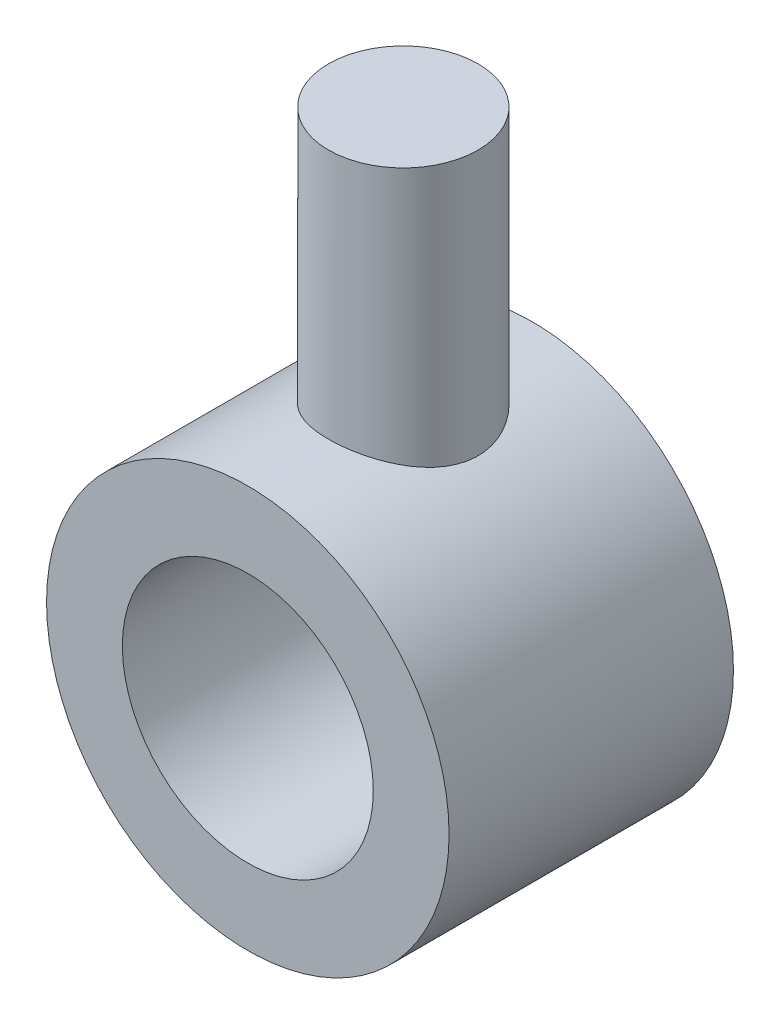
ISO-10303-21;
HEADER;
FILE_DESCRIPTION(('STEP AP214'),'2;1');
FILE_NAME('part.step','',(''),(''),'','','');
FILE_SCHEMA(('AUTOMOTIVE_DESIGN { 1 0 10303 214 1 1 1 1 }'));
ENDSEC;
DATA;
#1=APPLICATION_CONTEXT('core data for automotive mechanical design processes');
#2=APPLICATION_PROTOCOL_DEFINITION('international standard','automotive_design',2000,#1);
#3=PRODUCT_CONTEXT('',#1,'mechanical');
#4=PRODUCT('Part','Part','',(#3));
#5=PRODUCT_RELATED_PRODUCT_CATEGORY('part','',(#4));
#6=PRODUCT_DEFINITION_FORMATION('','',#4);
#7=PRODUCT_DEFINITION_CONTEXT('part definition',#1,'design');
#8=PRODUCT_DEFINITION('design','',#6,#7);
#9=PRODUCT_DEFINITION_SHAPE('','',#8);
#10=(LENGTH_UNIT() NAMED_UNIT(*) SI_UNIT(.MILLI.,.METRE.));
#11=(NAMED_UNIT(*) PLANE_ANGLE_UNIT() SI_UNIT($,.RADIAN.));
#12=(NAMED_UNIT(*) SI_UNIT($,.STERADIAN.) SOLID_ANGLE_UNIT());
#13=UNCERTAINTY_MEASURE_WITH_UNIT(LENGTH_MEASURE(1.E-05),#10,'distance_accuracy_value','');
#14=(GEOMETRIC_REPRESENTATION_CONTEXT(3) GLOBAL_UNCERTAINTY_ASSIGNED_CONTEXT((#13)) GLOBAL_UNIT_ASSIGNED_CONTEXT((#10,
#11,#12)) REPRESENTATION_CONTEXT('',''));
#15=CARTESIAN_POINT('',(0.,0.,0.));
#16=DIRECTION('',(0.,0.,1.));
#17=DIRECTION('',(1.,0.,0.));
#18=AXIS2_PLACEMENT_3D('',#15,#16,#17);
#19=CARTESIAN_POINT('',(0.,0.,17.));
#20=DIRECTION('',(0.,0.,-1.));
#21=DIRECTION('',(-1.,0.,0.));
#22=AXIS2_PLACEMENT_3D('',#19,#20,#21);
#23=CYLINDRICAL_SURFACE('',#22,12.0311317700619);
#24=CARTESIAN_POINT('',(0.,0.,17.));
#25=DIRECTION('',(0.,0.,1.));
#26=DIRECTION('',(1.,0.,0.));
#27=AXIS2_PLACEMENT_3D('',#24,#25,#26);
#28=CIRCLE('',#27,12.0311317700619);
#29=CARTESIAN_POINT('',(12.0311317700619,0.,17.));
#30=VERTEX_POINT('',#29);
#31=EDGE_CURVE('E42',#30,#30,#28,.T.);
#32=ORIENTED_EDGE('',*,*,#31,.F.);
#33=EDGE_LOOP('',(#32));
#34=FACE_BOUND('',#33,.T.);
#35=CARTESIAN_POINT('',(0.,0.,0.));
#36=DIRECTION('',(0.,0.,1.));
#37=DIRECTION('',(1.,0.,0.));
#38=AXIS2_PLACEMENT_3D('',#35,#36,#37);
#39=CIRCLE('',#38,12.0311317700619);
#40=CARTESIAN_POINT('',(12.0311317700619,0.,0.));
#41=VERTEX_POINT('',#40);
#42=EDGE_CURVE('E46',#41,#41,#39,.T.);
#43=ORIENTED_EDGE('',*,*,#42,.T.);
#44=EDGE_LOOP('',(#43));
#45=FACE_BOUND('',#44,.T.);
#46=CARTESIAN_POINT('',(0.,12.0311317700619,3.23539607241052));
#47=CARTESIAN_POINT('',(-0.121062453147284,12.0311321418385,3.2353955656686));
#48=CARTESIAN_POINT('',(-0.242117764825066,12.0293005389659,3.24031918795354));
#49=CARTESIAN_POINT('',(-0.483363061563554,12.0220238371442,3.25996505195856));
#50=CARTESIAN_POINT('',(-0.603552753904085,12.016577568968,3.27469046424478));
#51=CARTESIAN_POINT('',(-0.842076474898099,12.0022209607705,3.31378613627084));
#52=CARTESIAN_POINT('',(-0.96041142189433,11.9933123952809,3.33815145538274));
#53=CARTESIAN_POINT('',(-1.19449408109188,11.9722651890888,3.39630207070793));
#54=CARTESIAN_POINT('',(-1.31024076975202,11.9601252941972,3.43009102479927));
#55=CARTESIAN_POINT('',(-1.53805871950658,11.9329640161619,3.50669426527908));
#56=CARTESIAN_POINT('',(-1.65013792838545,11.9179494244257,3.54948730284648));
#57=CARTESIAN_POINT('',(-1.87020668320775,11.8854053918829,3.64378233192462));
#58=CARTESIAN_POINT('',(-1.97819469478957,11.8678750191321,3.69528755203978));
#59=CARTESIAN_POINT('',(-2.29498816504906,11.8121537546112,3.8622901456449));
#60=CARTESIAN_POINT('',(-2.4968002155916,11.7708105732722,3.99033444150311));
#61=CARTESIAN_POINT('',(-2.88396455788971,11.6821201856514,4.28159663656498));
#62=CARTESIAN_POINT('',(-3.06841041262312,11.6346054730234,4.44595784359966));
#63=CARTESIAN_POINT('',(-3.40793844255647,11.5397215331813,4.80296817368314));
#64=CARTESIAN_POINT('',(-3.56301187441617,11.4923523534034,4.99562568953881));
#65=CARTESIAN_POINT('',(-3.77307405128183,11.4244366877513,5.30605663089239));
#66=CARTESIAN_POINT('',(-3.84033556977528,11.4019440544378,5.41529833466104));
#67=CARTESIAN_POINT('',(-3.96536425024476,11.3590659627008,5.63946390579084));
#68=CARTESIAN_POINT('',(-4.02313521396815,11.3386796617383,5.75438547378297));
#69=CARTESIAN_POINT('',(-4.1286999678878,11.3006690462652,5.98917663682368));
#70=CARTESIAN_POINT('',(-4.17649253628868,11.2830450700506,6.10904683565307));
#71=CARTESIAN_POINT('',(-4.26162195146296,11.2511678198764,6.35282396427812));
#72=CARTESIAN_POINT('',(-4.29896381568095,11.2369129289121,6.47672892495217));
#73=CARTESIAN_POINT('',(-4.36154770304307,11.2127656591319,6.722656876039));
#74=CARTESIAN_POINT('',(-4.38721373184436,11.2027216728735,6.84455710960056));
#75=CARTESIAN_POINT('',(-4.42829270734374,11.1865474732705,7.09027972801885));
#76=CARTESIAN_POINT('',(-4.44371011847615,11.1804155558235,7.21410125184917));
#77=CARTESIAN_POINT('',(-4.46413480065957,11.1722761293122,7.46271849380264));
#78=CARTESIAN_POINT('',(-4.46914354924111,11.1702680348635,7.58751407113211));
#79=CARTESIAN_POINT('',(-4.46869847397152,11.1704460684372,7.83707911065713));
#80=CARTESIAN_POINT('',(-4.46324504530792,11.1726320380374,7.96184857366106));
#81=CARTESIAN_POINT('',(-4.44256327914055,11.1808711593053,8.20304493596865));
#82=CARTESIAN_POINT('',(-4.42792865963776,11.1866893238244,8.31953093523788));
#83=CARTESIAN_POINT('',(-4.38959928784518,11.2017837720207,8.55078608329479));
#84=CARTESIAN_POINT('',(-4.36590152243645,11.2110612057351,8.66555464790679));
#85=CARTESIAN_POINT('',(-4.28151768561937,11.2436861827355,9.00604551109919));
#86=CARTESIAN_POINT('',(-4.20752247618576,11.2718344190303,9.22816538425095));
#87=CARTESIAN_POINT('',(-4.02488238663565,11.3383410906637,9.66082885485413));
#88=CARTESIAN_POINT('',(-3.91561565058379,11.376880551089,9.8710784384977));
#89=CARTESIAN_POINT('',(-3.66594553721906,11.459766676858,10.2709835433449));
#90=CARTESIAN_POINT('',(-3.52553155383582,11.5041153181969,10.4606320167365));
#91=CARTESIAN_POINT('',(-3.20667043856165,11.5971852422524,10.8270443296561));
#92=CARTESIAN_POINT('',(-3.02632786810833,11.6460021711952,11.002137702902));
#93=CARTESIAN_POINT('',(-2.63827276662494,11.7399942007947,11.320089639007));
#94=CARTESIAN_POINT('',(-2.4305561934581,11.7851687620163,11.4629434327952));
#95=CARTESIAN_POINT('',(-1.98945519151724,11.8676542168728,11.7141531113142));
#96=CARTESIAN_POINT('',(-1.75573411222706,11.9048377638532,11.8219626360804));
#97=CARTESIAN_POINT('',(-1.27174853652192,11.966209042103,11.9961817643332));
#98=CARTESIAN_POINT('',(-1.02149129612425,11.9904024314408,12.0626093943813));
#99=CARTESIAN_POINT('',(-0.525598665281802,12.0220779650883,12.1489912334116));
#100=CARTESIAN_POINT('',(-0.28040632584702,12.0303680944661,12.1711947574985));
#101=CARTESIAN_POINT('',(0.210311958336977,12.0317933519476,12.175035020665));
#102=CARTESIAN_POINT('',(0.455837819242463,12.0249317650422,12.1566805529815));
#103=CARTESIAN_POINT('',(0.930597918913636,11.9973578668766,12.0816423311788));
#104=CARTESIAN_POINT('',(1.16009771336451,11.9771753428864,12.0264237705773));
#105=CARTESIAN_POINT('',(1.6064203170689,11.9255212555802,11.8811452726755));
#106=CARTESIAN_POINT('',(1.82324147263004,11.8940482234304,11.7910808019918));
#107=CARTESIAN_POINT('',(2.24513584714636,11.8217876801366,11.5758103187955));
#108=CARTESIAN_POINT('',(2.44968192335265,11.7807552565073,11.4496559055815));
#109=CARTESIAN_POINT('',(2.83538098631882,11.6939255030559,11.1668620966272));
#110=CARTESIAN_POINT('',(3.0165254136235,11.6481264407711,11.0102115987739));
#111=CARTESIAN_POINT('',(3.36105643944355,11.5535777420565,10.660377918956));
#112=CARTESIAN_POINT('',(3.52284600397406,11.5048085056235,10.4656231329618));
#113=CARTESIAN_POINT('',(3.8117521095632,11.4123509431571,10.0507590779828));
#114=CARTESIAN_POINT('',(3.93886584717339,11.3686630280987,9.83064776103471));
#115=CARTESIAN_POINT('',(4.15486163313549,11.2915245885592,9.36968235006639));
#116=CARTESIAN_POINT('',(4.24360911780512,11.2581102133482,9.12875874762002));
#117=CARTESIAN_POINT('',(4.37870857829357,11.2062652308089,8.63380381277855));
#118=CARTESIAN_POINT('',(4.42508611007913,11.1878255920279,8.37978047946962));
#119=CARTESIAN_POINT('',(4.47186918973617,11.1692027976222,7.88310507623116));
#120=CARTESIAN_POINT('',(4.47499139960427,11.1679408839738,7.64074715260635));
#121=CARTESIAN_POINT('',(4.44211023700645,11.1810596547064,7.15915443210282));
#122=CARTESIAN_POINT('',(4.40611043143151,11.1954389130272,6.91991935251588));
#123=CARTESIAN_POINT('',(4.29810924140977,11.2373293939253,6.45848740779812));
#124=CARTESIAN_POINT('',(4.22719641856912,11.2644424751712,6.23599648263434));
#125=CARTESIAN_POINT('',(4.0523242743943,11.3285224424333,5.80593074719323));
#126=CARTESIAN_POINT('',(3.94835667498216,11.3654917964317,5.59835968935791));
#127=CARTESIAN_POINT('',(3.70411991769644,11.4474906541987,5.19238631134774));
#128=CARTESIAN_POINT('',(3.5622519025616,11.4928380461671,4.9950127823364));
#129=CARTESIAN_POINT('',(3.24860459952563,11.5853932621102,4.62593244148572));
#130=CARTESIAN_POINT('',(3.07681589705052,11.6326016680268,4.45423373995453));
#131=CARTESIAN_POINT('',(2.79495239753257,11.7024124123421,4.21492905144529));
#132=CARTESIAN_POINT('',(2.69412922101017,11.7260899031595,4.13650592554698));
#133=CARTESIAN_POINT('',(2.48593045249919,11.7719846662226,3.98844449877152));
#134=CARTESIAN_POINT('',(2.37855729338039,11.7942024743481,3.91880296525975));
#135=CARTESIAN_POINT('',(2.15787269422919,11.8365683477759,3.78880151901984));
#136=CARTESIAN_POINT('',(2.04455830900759,11.8567153716148,3.72844626915061));
#137=CARTESIAN_POINT('',(1.81283941703378,11.8943479616981,3.61758734345448));
#138=CARTESIAN_POINT('',(1.69443711057574,11.9118346638477,3.56707946038728));
#139=CARTESIAN_POINT('',(1.44899844399712,11.9442202985137,3.47472313921121));
#140=CARTESIAN_POINT('',(1.32180471347639,11.9590036132834,3.43325124493221));
#141=CARTESIAN_POINT('',(1.06389880316381,11.9847000561687,3.36182105874718));
#142=CARTESIAN_POINT('',(0.933188181188243,11.9956148684432,3.33185775608006));
#143=CARTESIAN_POINT('',(0.669345606103074,12.0132254235394,3.28377296513536));
#144=CARTESIAN_POINT('',(0.536214047700944,12.0199218478894,3.26564956396986));
#145=CARTESIAN_POINT('',(0.268718642901178,12.0288745885052,3.24146201355239));
#146=CARTESIAN_POINT('',(0.134354923545805,12.0311313574647,3.23539663479192));
#147=CARTESIAN_POINT('',(0.,12.0311317700619,3.23539607241052));
#148=B_SPLINE_CURVE_WITH_KNOTS('',3,(#46,#47,#48,#49,#50,#51,#52,#53,#54,#55,#56,#57,#58,#59,
#60,#61,#62,#63,#64,#65,#66,#67,#68,#69,#70,#71,#72,#73,#74,#75,#76,#77,#78,#79,#80,#81,#82,#83,
#84,#85,#86,#87,#88,#89,#90,#91,#92,#93,#94,#95,#96,#97,#98,#99,#100,#101,#102,#103,#104,#105,
#106,#107,#108,#109,#110,#111,#112,#113,#114,#115,#116,#117,#118,#119,#120,#121,#122,#123,#124,
#125,#126,#127,#128,#129,#130,#131,#132,#133,#134,#135,#136,#137,#138,#139,#140,#141,#142,#143,
#144,#145,#146,#147),.UNSPECIFIED.,.T.,.F.,(4,2,2,2,2,2,2,2,2,2,2,2,2,2,2,2,2,2,2,2,2,2,2,2,2,2,
2,2,2,2,2,2,2,2,2,2,2,2,2,2,2,2,2,2,2,2,2,2,2,2,4),(0.,0.363061646063201,0.726240788085054,
1.08923403480088,1.45236837754206,1.81465517942713,2.17707653470156,2.90136090095415,
3.65292953452226,4.40472153844458,4.79505455936339,5.18523083652139,5.57545486047086,
5.9654912129119,6.3399364256419,6.7142184179745,7.08844727659684,7.46266199976121,
7.81486935998034,8.16719391642552,8.87121085179101,9.58838810065835,10.3058099342427,
11.0704674611029,11.8352380266317,12.6114160289552,13.3872556798675,14.1225100049859,
14.8576049378174,15.5650961494169,16.2726794351787,17.0009019022663,17.7293899765117,
18.4993316518707,19.2693355565321,20.0420186418196,20.8142353653571,21.5377158386116,
22.2611303551548,22.9632954939449,23.6656366182653,24.4042876969661,25.1431716142281,
25.5325034615743,25.9216915690756,26.3110744636636,26.7002906299496,27.1034978592494,
27.5065293353716,27.9094956804766,28.3124209346005),.UNSPECIFIED.);
#149=CARTESIAN_POINT('',(0.,12.0311317700619,3.23539607241052));
#150=VERTEX_POINT('',#149);
#151=EDGE_CURVE('E10',#150,#150,#148,.T.);
#152=ORIENTED_EDGE('',*,*,#151,.F.);
#153=EDGE_LOOP('',(#152));
#154=FACE_BOUND('',#153,.T.);
#155=ADVANCED_FACE('F31',(#34,#45,#154),#23,.T.);
#156=CARTESIAN_POINT('',(0.,0.,17.));
#157=DIRECTION('',(0.,0.,1.));
#158=DIRECTION('',(1.,0.,0.));
#159=AXIS2_PLACEMENT_3D('',#156,#157,#158);
#160=PLANE('',#159);
#161=ORIENTED_EDGE('',*,*,#31,.T.);
#162=EDGE_LOOP('',(#161));
#163=FACE_BOUND('',#162,.T.);
#164=CARTESIAN_POINT('',(0.,0.,17.));
#165=DIRECTION('',(0.,0.,1.));
#166=DIRECTION('',(1.,0.,0.));
#167=AXIS2_PLACEMENT_3D('',#164,#165,#166);
#168=CIRCLE('',#167,7.5);
#169=CARTESIAN_POINT('',(7.5,0.,17.));
#170=VERTEX_POINT('',#169);
#171=EDGE_CURVE('E51',#170,#170,#168,.T.);
#172=ORIENTED_EDGE('',*,*,#171,.F.);
#173=EDGE_LOOP('',(#172));
#174=FACE_BOUND('',#173,.T.);
#175=ADVANCED_FACE('F77',(#163,#174),#160,.T.);
#176=CARTESIAN_POINT('',(0.,0.,0.));
#177=DIRECTION('',(0.,0.,1.));
#178=DIRECTION('',(1.,0.,0.));
#179=AXIS2_PLACEMENT_3D('',#176,#177,#178);
#180=PLANE('',#179);
#181=ORIENTED_EDGE('',*,*,#42,.F.);
#182=EDGE_LOOP('',(#181));
#183=FACE_BOUND('',#182,.T.);
#184=CARTESIAN_POINT('',(0.,0.,0.));
#185=DIRECTION('',(0.,0.,1.));
#186=DIRECTION('',(1.,0.,0.));
#187=AXIS2_PLACEMENT_3D('',#184,#185,#186);
#188=CIRCLE('',#187,7.5);
#189=CARTESIAN_POINT('',(7.5,0.,0.));
#190=VERTEX_POINT('',#189);
#191=EDGE_CURVE('E53',#190,#190,#188,.T.);
#192=ORIENTED_EDGE('',*,*,#191,.T.);
#193=EDGE_LOOP('',(#192));
#194=FACE_BOUND('',#193,.T.);
#195=ADVANCED_FACE('F72',(#183,#194),#180,.F.);
#196=CARTESIAN_POINT('',(0.,0.,17.));
#197=DIRECTION('',(0.,0.,-1.));
#198=DIRECTION('',(-1.,0.,0.));
#199=AXIS2_PLACEMENT_3D('',#196,#197,#198);
#200=CYLINDRICAL_SURFACE('',#199,7.5);
#201=ORIENTED_EDGE('',*,*,#171,.T.);
#202=EDGE_LOOP('',(#201));
#203=FACE_BOUND('',#202,.T.);
#204=ORIENTED_EDGE('',*,*,#191,.F.);
#205=EDGE_LOOP('',(#204));
#206=FACE_BOUND('',#205,.T.);
#207=ADVANCED_FACE('F66',(#203,#206),#200,.F.);
#208=CARTESIAN_POINT('',(0.,27.,7.70432419524782));
#209=DIRECTION('',(0.,-1.,0.));
#210=DIRECTION('',(0.,0.,-1.));
#211=AXIS2_PLACEMENT_3D('',#208,#209,#210);
#212=CYLINDRICAL_SURFACE('',#211,4.4689281228373);
#213=CARTESIAN_POINT('',(0.,27.,7.70432419524782));
#214=DIRECTION('',(0.,1.,0.));
#215=DIRECTION('',(0.,0.,1.));
#216=AXIS2_PLACEMENT_3D('',#213,#214,#215);
#217=CIRCLE('',#216,4.4689281228373);
#218=CARTESIAN_POINT('',(0.,27.,12.1732523180851));
#219=VERTEX_POINT('',#218);
#220=EDGE_CURVE('E56',#219,#219,#217,.T.);
#221=ORIENTED_EDGE('',*,*,#220,.F.);
#222=EDGE_LOOP('',(#221));
#223=FACE_BOUND('',#222,.T.);
#224=ORIENTED_EDGE('',*,*,#151,.T.);
#225=EDGE_LOOP('',(#224));
#226=FACE_BOUND('',#225,.T.);
#227=ADVANCED_FACE('F64',(#223,#226),#212,.T.);
#228=CARTESIAN_POINT('',(0.,27.,7.70432419524782));
#229=DIRECTION('',(0.,1.,0.));
#230=DIRECTION('',(0.,0.,1.));
#231=AXIS2_PLACEMENT_3D('',#228,#229,#230);
#232=PLANE('',#231);
#233=ORIENTED_EDGE('',*,*,#220,.T.);
#234=EDGE_LOOP('',(#233));
#235=FACE_BOUND('',#234,.T.);
#236=ADVANCED_FACE('F62',(#235),#232,.T.);
#237=CLOSED_SHELL('',(#155,#175,#195,#207,#227,#236));
#238=MANIFOLD_SOLID_BREP('B2',#237);
#239=ADVANCED_BREP_SHAPE_REPRESENTATION('',(#18,#238),#14);
#240=SHAPE_DEFINITION_REPRESENTATION(#9,#239);
ENDSEC;
END-ISO-10303-21;
